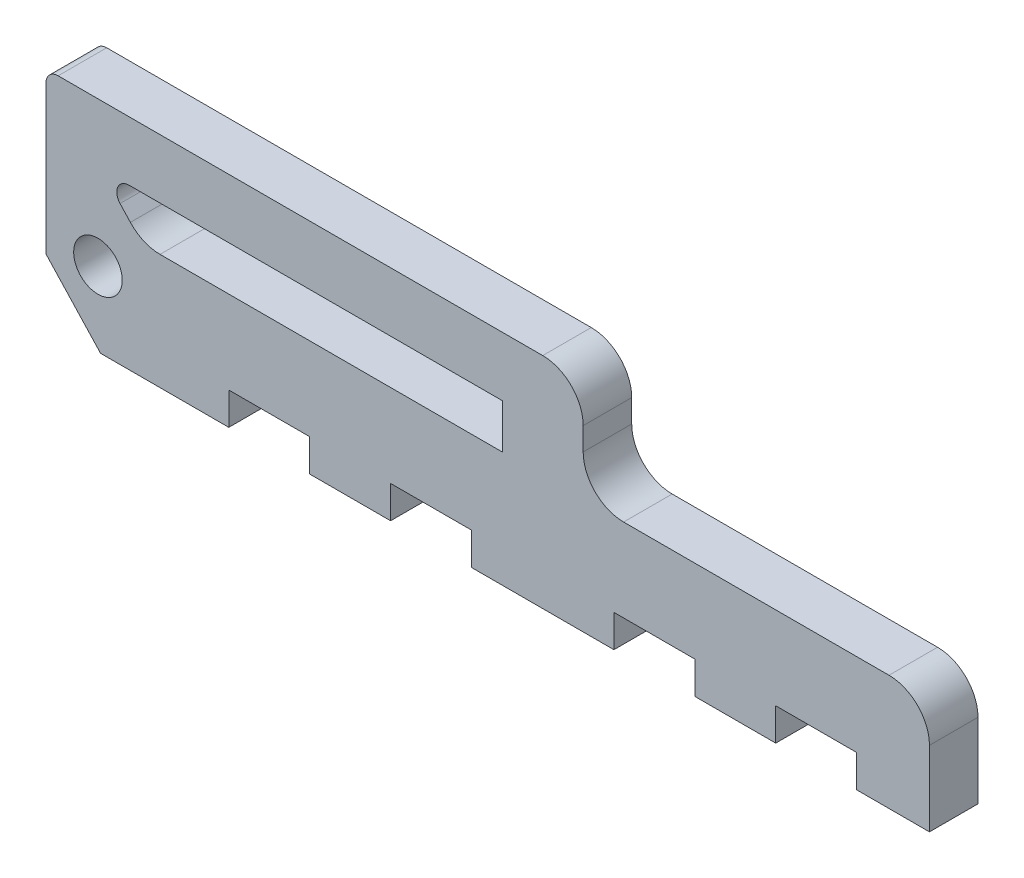
ISO-10303-21;
HEADER;
FILE_DESCRIPTION(('STEP AP214'),'2;1');
FILE_NAME('part.step','',(''),(''),'','','');
FILE_SCHEMA(('AUTOMOTIVE_DESIGN { 1 0 10303 214 1 1 1 1 }'));
ENDSEC;
DATA;
#1=APPLICATION_CONTEXT('core data for automotive mechanical design processes');
#2=APPLICATION_PROTOCOL_DEFINITION('international standard','automotive_design',2000,#1);
#3=PRODUCT_CONTEXT('',#1,'mechanical');
#4=PRODUCT('Part','Part','',(#3));
#5=PRODUCT_RELATED_PRODUCT_CATEGORY('part','',(#4));
#6=PRODUCT_DEFINITION_FORMATION('','',#4);
#7=PRODUCT_DEFINITION_CONTEXT('part definition',#1,'design');
#8=PRODUCT_DEFINITION('design','',#6,#7);
#9=PRODUCT_DEFINITION_SHAPE('','',#8);
#10=(LENGTH_UNIT() NAMED_UNIT(*) SI_UNIT(.MILLI.,.METRE.));
#11=(NAMED_UNIT(*) PLANE_ANGLE_UNIT() SI_UNIT($,.RADIAN.));
#12=(NAMED_UNIT(*) SI_UNIT($,.STERADIAN.) SOLID_ANGLE_UNIT());
#13=UNCERTAINTY_MEASURE_WITH_UNIT(LENGTH_MEASURE(1.E-05),#10,'distance_accuracy_value','');
#14=(GEOMETRIC_REPRESENTATION_CONTEXT(3) GLOBAL_UNCERTAINTY_ASSIGNED_CONTEXT((#13)) GLOBAL_UNIT_ASSIGNED_CONTEXT((#10,
#11,#12)) REPRESENTATION_CONTEXT('',''));
#15=CARTESIAN_POINT('',(0.,0.,0.));
#16=DIRECTION('',(0.,0.,1.));
#17=DIRECTION('',(1.,0.,0.));
#18=AXIS2_PLACEMENT_3D('',#15,#16,#17);
#19=CARTESIAN_POINT('',(10.9533371764944,-4.60706131559386,3.));
#20=DIRECTION('',(0.,0.,-1.));
#21=DIRECTION('',(-1.,0.,0.));
#22=AXIS2_PLACEMENT_3D('',#19,#20,#21);
#23=CYLINDRICAL_SURFACE('',#22,0.750000000000001);
#24=CARTESIAN_POINT('',(10.9533371764944,-4.60706131559386,0.));
#25=DIRECTION('',(0.,0.,-1.));
#26=DIRECTION('',(-1.,0.,0.));
#27=AXIS2_PLACEMENT_3D('',#24,#25,#26);
#28=CIRCLE('',#27,0.750000000000001);
#29=CARTESIAN_POINT('',(10.9533371764944,-3.85706131559386,0.));
#30=VERTEX_POINT('',#29);
#31=CARTESIAN_POINT('',(10.2033371764944,-4.60706131559386,0.));
#32=VERTEX_POINT('',#31);
#33=EDGE_CURVE('E19',#30,#32,#28,.F.);
#34=ORIENTED_EDGE('',*,*,#33,.T.);
#35=DIRECTION('',(0.,0.,-1.));
#36=VECTOR('',#35,1.);
#37=CARTESIAN_POINT('',(10.2033371764944,-4.60706131559386,3.));
#38=LINE('',#37,#36);
#39=CARTESIAN_POINT('',(10.2033371764944,-4.60706131559386,3.));
#40=VERTEX_POINT('',#39);
#41=EDGE_CURVE('E137',#32,#40,#38,.F.);
#42=ORIENTED_EDGE('',*,*,#41,.T.);
#43=CARTESIAN_POINT('',(10.9533371764944,-4.60706131559386,3.));
#44=DIRECTION('',(0.,0.,-1.));
#45=DIRECTION('',(-1.,0.,0.));
#46=AXIS2_PLACEMENT_3D('',#43,#44,#45);
#47=CIRCLE('',#46,0.750000000000001);
#48=CARTESIAN_POINT('',(10.9533371764944,-3.85706131559386,3.));
#49=VERTEX_POINT('',#48);
#50=EDGE_CURVE('E343',#40,#49,#47,.T.);
#51=ORIENTED_EDGE('',*,*,#50,.T.);
#52=DIRECTION('',(0.,0.,-1.));
#53=VECTOR('',#52,1.);
#54=CARTESIAN_POINT('',(10.9533371764944,-3.85706131559386,3.));
#55=LINE('',#54,#53);
#56=EDGE_CURVE('E140',#49,#30,#55,.T.);
#57=ORIENTED_EDGE('',*,*,#56,.T.);
#58=EDGE_LOOP('',(#34,#42,#51,#57));
#59=FACE_BOUND('',#58,.T.);
#60=ADVANCED_FACE('F16',(#59),#23,.T.);
#61=CARTESIAN_POINT('',(43.4,-3.85706131559386,3.));
#62=DIRECTION('',(-1.,0.,0.));
#63=DIRECTION('',(0.,0.,1.));
#64=AXIS2_PLACEMENT_3D('',#61,#62,#63);
#65=PLANE('',#64);
#66=DIRECTION('',(0.,0.,-1.));
#67=VECTOR('',#66,1.);
#68=CARTESIAN_POINT('',(43.4,-6.35706131559386,3.));
#69=LINE('',#68,#67);
#70=CARTESIAN_POINT('',(43.4,-6.35706131559386,3.));
#71=VERTEX_POINT('',#70);
#72=CARTESIAN_POINT('',(43.4,-6.35706131559386,0.));
#73=VERTEX_POINT('',#72);
#74=EDGE_CURVE('E318',#71,#73,#69,.T.);
#75=ORIENTED_EDGE('',*,*,#74,.F.);
#76=DIRECTION('',(0.,1.,0.));
#77=VECTOR('',#76,1.);
#78=CARTESIAN_POINT('',(43.4,0.,3.));
#79=LINE('',#78,#77);
#80=CARTESIAN_POINT('',(43.4,-7.76682140474012,3.));
#81=VERTEX_POINT('',#80);
#82=EDGE_CURVE('E344',#71,#81,#79,.F.);
#83=ORIENTED_EDGE('',*,*,#82,.T.);
#84=DIRECTION('',(0.,0.,1.));
#85=VECTOR('',#84,1.);
#86=CARTESIAN_POINT('',(43.4,-7.76682140474012,3.));
#87=LINE('',#86,#85);
#88=CARTESIAN_POINT('',(43.4,-7.76682140474012,0.));
#89=VERTEX_POINT('',#88);
#90=EDGE_CURVE('E313',#81,#89,#87,.F.);
#91=ORIENTED_EDGE('',*,*,#90,.T.);
#92=DIRECTION('',(0.,1.,0.));
#93=VECTOR('',#92,1.);
#94=CARTESIAN_POINT('',(43.4,-3.85706131559386,0.));
#95=LINE('',#94,#93);
#96=EDGE_CURVE('E142',#73,#89,#95,.F.);
#97=ORIENTED_EDGE('',*,*,#96,.F.);
#98=EDGE_LOOP('',(#75,#83,#91,#97));
#99=FACE_BOUND('',#98,.T.);
#100=ADVANCED_FACE('F412',(#99),#65,.F.);
#101=CARTESIAN_POINT('',(16.1596343147833,-10.2668214047401,3.));
#102=DIRECTION('',(0.732544010188143,0.680719672947296,0.));
#103=DIRECTION('',(-0.680719672947296,0.732544010188143,0.));
#104=AXIS2_PLACEMENT_3D('',#101,#102,#103);
#105=PLANE('',#104);
#106=DIRECTION('',(0.680719672947296,-0.732544010188143,0.));
#107=VECTOR('',#106,1.);
#108=CARTESIAN_POINT('',(14.7782975312678,-8.78032112124505,3.));
#109=LINE('',#108,#107);
#110=CARTESIAN_POINT('',(14.7782975312678,-8.78032112124505,3.));
#111=VERTEX_POINT('',#110);
#112=CARTESIAN_POINT('',(15.4179027710566,-9.46862058710836,3.));
#113=VERTEX_POINT('',#112);
#114=EDGE_CURVE('E341',#111,#113,#109,.T.);
#115=ORIENTED_EDGE('',*,*,#114,.T.);
#116=DIRECTION('',(0.,0.,1.));
#117=VECTOR('',#116,1.);
#118=CARTESIAN_POINT('',(15.4179027710566,-9.46862058710836,3.));
#119=LINE('',#118,#117);
#120=CARTESIAN_POINT('',(15.4179027710566,-9.46862058710836,0.));
#121=VERTEX_POINT('',#120);
#122=EDGE_CURVE('E181',#113,#121,#119,.F.);
#123=ORIENTED_EDGE('',*,*,#122,.T.);
#124=DIRECTION('',(-0.680719672947296,0.732544010188143,0.));
#125=VECTOR('',#124,1.);
#126=CARTESIAN_POINT('',(16.1596343147833,-10.2668214047401,0.));
#127=LINE('',#126,#125);
#128=CARTESIAN_POINT('',(14.7782975312678,-8.78032112124505,0.));
#129=VERTEX_POINT('',#128);
#130=EDGE_CURVE('E346',#121,#129,#127,.T.);
#131=ORIENTED_EDGE('',*,*,#130,.T.);
#132=DIRECTION('',(0.,0.,1.));
#133=VECTOR('',#132,1.);
#134=CARTESIAN_POINT('',(14.7782975312678,-8.78032112124505,3.));
#135=LINE('',#134,#133);
#136=EDGE_CURVE('E187',#129,#111,#135,.T.);
#137=ORIENTED_EDGE('',*,*,#136,.T.);
#138=EDGE_LOOP('',(#115,#123,#131,#137));
#139=FACE_BOUND('',#138,.T.);
#140=ADVANCED_FACE('F504',(#139),#105,.T.);
#141=CARTESIAN_POINT('',(0.,0.,3.));
#142=DIRECTION('',(0.,0.,-1.));
#143=DIRECTION('',(-1.,0.,0.));
#144=AXIS2_PLACEMENT_3D('',#141,#142,#143);
#145=PLANE('',#144);
#146=CARTESIAN_POINT('',(15.3277055389089,-8.26978136653458,3.));
#147=DIRECTION('',(0.,0.,1.));
#148=DIRECTION('',(1.,0.,0.));
#149=AXIS2_PLACEMENT_3D('',#146,#147,#148);
#150=CIRCLE('',#149,0.750000000000001);
#151=CARTESIAN_POINT('',(15.3277055389089,-7.51978136653458,3.));
#152=VERTEX_POINT('',#151);
#153=EDGE_CURVE('E184',#111,#152,#150,.F.);
#154=ORIENTED_EDGE('',*,*,#153,.T.);
#155=DIRECTION('',(1.,0.,0.));
#156=VECTOR('',#155,1.);
#157=CARTESIAN_POINT('',(13.6069355412309,-7.51978136653458,3.));
#158=LINE('',#157,#156);
#159=CARTESIAN_POINT('',(38.4000000000001,-7.51978136653458,3.));
#160=VERTEX_POINT('',#159);
#161=EDGE_CURVE('E188',#160,#152,#158,.F.);
#162=ORIENTED_EDGE('',*,*,#161,.F.);
#163=DIRECTION('',(0.,1.,0.));
#164=VECTOR('',#163,1.);
#165=CARTESIAN_POINT('',(38.4000000000001,-7.51978136653458,3.));
#166=LINE('',#165,#164);
#167=CARTESIAN_POINT('',(38.4000000000001,-10.2668214047401,3.));
#168=VERTEX_POINT('',#167);
#169=EDGE_CURVE('E178',#168,#160,#166,.T.);
#170=ORIENTED_EDGE('',*,*,#169,.F.);
#171=DIRECTION('',(1.,0.,0.));
#172=VECTOR('',#171,1.);
#173=CARTESIAN_POINT('',(38.4000000000001,-10.2668214047401,3.));
#174=LINE('',#173,#172);
#175=CARTESIAN_POINT('',(17.249262796527,-10.2668214047401,3.));
#176=VERTEX_POINT('',#175);
#177=EDGE_CURVE('E172',#176,#168,#174,.T.);
#178=ORIENTED_EDGE('',*,*,#177,.F.);
#179=CARTESIAN_POINT('',(17.249262796527,-7.76682140474012,3.));
#180=DIRECTION('',(0.,0.,1.));
#181=DIRECTION('',(1.,0.,0.));
#182=AXIS2_PLACEMENT_3D('',#179,#180,#181);
#183=CIRCLE('',#182,2.5);
#184=EDGE_CURVE('E173',#176,#113,#183,.F.);
#185=ORIENTED_EDGE('',*,*,#184,.T.);
#186=ORIENTED_EDGE('',*,*,#114,.F.);
#187=EDGE_LOOP('',(#154,#162,#170,#178,#185,#186));
#188=FACE_BOUND('',#187,.T.);
#189=ORIENTED_EDGE('',*,*,#50,.F.);
#190=DIRECTION('',(0.,1.,0.));
#191=VECTOR('',#190,1.);
#192=CARTESIAN_POINT('',(10.2033371764944,-13.7730374042159,3.));
#193=LINE('',#192,#191);
#194=CARTESIAN_POINT('',(10.2033371764944,-13.7730374042159,3.));
#195=VERTEX_POINT('',#194);
#196=EDGE_CURVE('E149',#40,#195,#193,.F.);
#197=ORIENTED_EDGE('',*,*,#196,.T.);
#198=DIRECTION('',(-0.680719672947296,0.732544010188143,0.));
#199=VECTOR('',#198,1.);
#200=CARTESIAN_POINT('',(11.2149622460133,-14.8616791971344,3.));
#201=LINE('',#200,#199);
#202=CARTESIAN_POINT('',(13.5737077721943,-17.4,3.));
#203=VERTEX_POINT('',#202);
#204=EDGE_CURVE('E197',#195,#203,#201,.F.);
#205=ORIENTED_EDGE('',*,*,#204,.T.);
#206=DIRECTION('',(1.,0.,0.));
#207=VECTOR('',#206,1.);
#208=CARTESIAN_POINT('',(17.,-17.4,3.));
#209=LINE('',#208,#207);
#210=CARTESIAN_POINT('',(21.5,-17.4,3.));
#211=VERTEX_POINT('',#210);
#212=EDGE_CURVE('E202',#203,#211,#209,.T.);
#213=ORIENTED_EDGE('',*,*,#212,.T.);
#214=DIRECTION('',(0.,-1.,0.));
#215=VECTOR('',#214,1.);
#216=CARTESIAN_POINT('',(21.5000000000001,-17.4,3.));
#217=LINE('',#216,#215);
#218=CARTESIAN_POINT('',(21.5,-15.4,3.));
#219=VERTEX_POINT('',#218);
#220=EDGE_CURVE('E208',#211,#219,#217,.F.);
#221=ORIENTED_EDGE('',*,*,#220,.T.);
#222=DIRECTION('',(1.,0.,0.));
#223=VECTOR('',#222,1.);
#224=CARTESIAN_POINT('',(21.5,-15.4,3.));
#225=LINE('',#224,#223);
#226=CARTESIAN_POINT('',(26.5,-15.4,3.));
#227=VERTEX_POINT('',#226);
#228=EDGE_CURVE('E214',#219,#227,#225,.T.);
#229=ORIENTED_EDGE('',*,*,#228,.T.);
#230=DIRECTION('',(0.,1.,0.));
#231=VECTOR('',#230,1.);
#232=CARTESIAN_POINT('',(26.5,-15.4,3.));
#233=LINE('',#232,#231);
#234=CARTESIAN_POINT('',(26.5000000000001,-17.4,3.));
#235=VERTEX_POINT('',#234);
#236=EDGE_CURVE('E220',#227,#235,#233,.F.);
#237=ORIENTED_EDGE('',*,*,#236,.T.);
#238=DIRECTION('',(1.,0.,0.));
#239=VECTOR('',#238,1.);
#240=CARTESIAN_POINT('',(26.5000000000001,-17.4,3.));
#241=LINE('',#240,#239);
#242=CARTESIAN_POINT('',(31.5000000000001,-17.4,3.));
#243=VERTEX_POINT('',#242);
#244=EDGE_CURVE('E226',#235,#243,#241,.T.);
#245=ORIENTED_EDGE('',*,*,#244,.T.);
#246=DIRECTION('',(0.,-1.,0.));
#247=VECTOR('',#246,1.);
#248=CARTESIAN_POINT('',(31.5000000000001,-17.4,3.));
#249=LINE('',#248,#247);
#250=CARTESIAN_POINT('',(31.5,-15.4,3.));
#251=VERTEX_POINT('',#250);
#252=EDGE_CURVE('E232',#243,#251,#249,.F.);
#253=ORIENTED_EDGE('',*,*,#252,.T.);
#254=DIRECTION('',(1.,0.,0.));
#255=VECTOR('',#254,1.);
#256=CARTESIAN_POINT('',(31.5,-15.4,3.));
#257=LINE('',#256,#255);
#258=CARTESIAN_POINT('',(36.5,-15.4,3.));
#259=VERTEX_POINT('',#258);
#260=EDGE_CURVE('E238',#251,#259,#257,.T.);
#261=ORIENTED_EDGE('',*,*,#260,.T.);
#262=DIRECTION('',(0.,1.,0.));
#263=VECTOR('',#262,1.);
#264=CARTESIAN_POINT('',(36.5,-15.4,3.));
#265=LINE('',#264,#263);
#266=CARTESIAN_POINT('',(36.5000000000001,-17.4,3.));
#267=VERTEX_POINT('',#266);
#268=EDGE_CURVE('E244',#259,#267,#265,.F.);
#269=ORIENTED_EDGE('',*,*,#268,.T.);
#270=DIRECTION('',(1.,0.,0.));
#271=VECTOR('',#270,1.);
#272=CARTESIAN_POINT('',(45.3,-17.4,3.));
#273=LINE('',#272,#271);
#274=CARTESIAN_POINT('',(45.3,-17.4,3.));
#275=VERTEX_POINT('',#274);
#276=EDGE_CURVE('E250',#267,#275,#273,.T.);
#277=ORIENTED_EDGE('',*,*,#276,.T.);
#278=DIRECTION('',(0.,1.,0.));
#279=VECTOR('',#278,1.);
#280=CARTESIAN_POINT('',(45.3,-15.4,3.));
#281=LINE('',#280,#279);
#282=CARTESIAN_POINT('',(45.3,-15.4,3.));
#283=VERTEX_POINT('',#282);
#284=EDGE_CURVE('E256',#275,#283,#281,.T.);
#285=ORIENTED_EDGE('',*,*,#284,.T.);
#286=DIRECTION('',(-1.,0.,0.));
#287=VECTOR('',#286,1.);
#288=CARTESIAN_POINT('',(50.3,-15.4,3.));
#289=LINE('',#288,#287);
#290=CARTESIAN_POINT('',(50.3,-15.4,3.));
#291=VERTEX_POINT('',#290);
#292=EDGE_CURVE('E262',#283,#291,#289,.F.);
#293=ORIENTED_EDGE('',*,*,#292,.T.);
#294=DIRECTION('',(0.,1.,0.));
#295=VECTOR('',#294,1.);
#296=CARTESIAN_POINT('',(50.3,-17.4,3.));
#297=LINE('',#296,#295);
#298=CARTESIAN_POINT('',(50.3,-17.4,3.));
#299=VERTEX_POINT('',#298);
#300=EDGE_CURVE('E268',#291,#299,#297,.F.);
#301=ORIENTED_EDGE('',*,*,#300,.T.);
#302=DIRECTION('',(1.,0.,0.));
#303=VECTOR('',#302,1.);
#304=CARTESIAN_POINT('',(55.3000000000001,-17.4,3.));
#305=LINE('',#304,#303);
#306=CARTESIAN_POINT('',(55.3000000000001,-17.4,3.));
#307=VERTEX_POINT('',#306);
#308=EDGE_CURVE('E274',#299,#307,#305,.T.);
#309=ORIENTED_EDGE('',*,*,#308,.T.);
#310=DIRECTION('',(0.,1.,0.));
#311=VECTOR('',#310,1.);
#312=CARTESIAN_POINT('',(55.3000000000001,-15.4,3.));
#313=LINE('',#312,#311);
#314=CARTESIAN_POINT('',(55.3000000000001,-15.4,3.));
#315=VERTEX_POINT('',#314);
#316=EDGE_CURVE('E280',#307,#315,#313,.T.);
#317=ORIENTED_EDGE('',*,*,#316,.T.);
#318=DIRECTION('',(1.,0.,0.));
#319=VECTOR('',#318,1.);
#320=CARTESIAN_POINT('',(60.3,-15.4,3.));
#321=LINE('',#320,#319);
#322=CARTESIAN_POINT('',(60.3,-15.4,3.));
#323=VERTEX_POINT('',#322);
#324=EDGE_CURVE('E286',#315,#323,#321,.T.);
#325=ORIENTED_EDGE('',*,*,#324,.T.);
#326=DIRECTION('',(0.,1.,0.));
#327=VECTOR('',#326,1.);
#328=CARTESIAN_POINT('',(60.3,-17.4,3.));
#329=LINE('',#328,#327);
#330=CARTESIAN_POINT('',(60.3,-17.4,3.));
#331=VERTEX_POINT('',#330);
#332=EDGE_CURVE('E303',#323,#331,#329,.F.);
#333=ORIENTED_EDGE('',*,*,#332,.T.);
#334=DIRECTION('',(1.,0.,0.));
#335=VECTOR('',#334,1.);
#336=CARTESIAN_POINT('',(64.8000000000001,-17.4,3.));
#337=LINE('',#336,#335);
#338=CARTESIAN_POINT('',(64.8000000000001,-17.4,3.));
#339=VERTEX_POINT('',#338);
#340=EDGE_CURVE('E292',#331,#339,#337,.T.);
#341=ORIENTED_EDGE('',*,*,#340,.T.);
#342=DIRECTION('',(0.,1.,0.));
#343=VECTOR('',#342,1.);
#344=CARTESIAN_POINT('',(64.8000000000001,-17.4,3.));
#345=LINE('',#344,#343);
#346=CARTESIAN_POINT('',(64.8000000000001,-12.7668214047401,3.));
#347=VERTEX_POINT('',#346);
#348=EDGE_CURVE('E293',#339,#347,#345,.T.);
#349=ORIENTED_EDGE('',*,*,#348,.T.);
#350=CARTESIAN_POINT('',(62.3,-12.7668214047401,3.));
#351=DIRECTION('',(0.,0.,-1.));
#352=DIRECTION('',(-1.,0.,0.));
#353=AXIS2_PLACEMENT_3D('',#350,#351,#352);
#354=CIRCLE('',#353,2.5);
#355=CARTESIAN_POINT('',(62.3,-10.2668214047401,3.));
#356=VERTEX_POINT('',#355);
#357=EDGE_CURVE('E309',#356,#347,#354,.T.);
#358=ORIENTED_EDGE('',*,*,#357,.F.);
#359=DIRECTION('',(1.,0.,0.));
#360=VECTOR('',#359,1.);
#361=CARTESIAN_POINT('',(64.8000000000001,-10.2668214047401,3.));
#362=LINE('',#361,#360);
#363=CARTESIAN_POINT('',(45.9,-10.2668214047401,3.));
#364=VERTEX_POINT('',#363);
#365=EDGE_CURVE('E312',#356,#364,#362,.F.);
#366=ORIENTED_EDGE('',*,*,#365,.T.);
#367=CARTESIAN_POINT('',(45.9,-7.76682140474012,3.));
#368=DIRECTION('',(0.,0.,1.));
#369=DIRECTION('',(1.,0.,0.));
#370=AXIS2_PLACEMENT_3D('',#367,#368,#369);
#371=CIRCLE('',#370,2.5);
#372=EDGE_CURVE('E316',#364,#81,#371,.F.);
#373=ORIENTED_EDGE('',*,*,#372,.T.);
#374=ORIENTED_EDGE('',*,*,#82,.F.);
#375=CARTESIAN_POINT('',(40.9,-6.35706131559386,3.));
#376=DIRECTION('',(0.,0.,-1.));
#377=DIRECTION('',(-1.,0.,0.));
#378=AXIS2_PLACEMENT_3D('',#375,#376,#377);
#379=CIRCLE('',#378,2.5);
#380=CARTESIAN_POINT('',(40.9,-3.85706131559386,3.));
#381=VERTEX_POINT('',#380);
#382=EDGE_CURVE('E321',#381,#71,#379,.T.);
#383=ORIENTED_EDGE('',*,*,#382,.F.);
#384=DIRECTION('',(1.,0.,0.));
#385=VECTOR('',#384,1.);
#386=CARTESIAN_POINT('',(10.2033371764944,-3.85706131559386,3.));
#387=LINE('',#386,#385);
#388=EDGE_CURVE('E324',#381,#49,#387,.F.);
#389=ORIENTED_EDGE('',*,*,#388,.T.);
#390=EDGE_LOOP('',(#189,#197,#205,#213,#221,#229,#237,#245,#253,#261,#269,#277,#285,#293,#301,
#309,#317,#325,#333,#341,#349,#358,#366,#373,#374,#383,#389));
#391=FACE_BOUND('',#390,.T.);
#392=CARTESIAN_POINT('',(13.4125942765777,-12.8195201782925,3.));
#393=DIRECTION('',(0.,0.,-1.));
#394=DIRECTION('',(-1.,0.,0.));
#395=AXIS2_PLACEMENT_3D('',#392,#393,#394);
#396=CIRCLE('',#395,1.5);
#397=CARTESIAN_POINT('',(11.9125942765777,-12.8195201782925,3.));
#398=VERTEX_POINT('',#397);
#399=EDGE_CURVE('E150',#398,#398,#396,.T.);
#400=ORIENTED_EDGE('',*,*,#399,.T.);
#401=EDGE_LOOP('',(#400));
#402=FACE_BOUND('',#401,.T.);
#403=ADVANCED_FACE('F403',(#188,#391,#402),#145,.F.);
#404=CARTESIAN_POINT('',(13.4125942765777,-12.8195201782925,3.));
#405=DIRECTION('',(0.,0.,-1.));
#406=DIRECTION('',(-1.,0.,0.));
#407=AXIS2_PLACEMENT_3D('',#404,#405,#406);
#408=CYLINDRICAL_SURFACE('',#407,1.5);
#409=ORIENTED_EDGE('',*,*,#399,.F.);
#410=EDGE_LOOP('',(#409));
#411=FACE_BOUND('',#410,.T.);
#412=CARTESIAN_POINT('',(13.4125942765777,-12.8195201782925,0.));
#413=DIRECTION('',(0.,0.,-1.));
#414=DIRECTION('',(-1.,0.,0.));
#415=AXIS2_PLACEMENT_3D('',#412,#413,#414);
#416=CIRCLE('',#415,1.5);
#417=CARTESIAN_POINT('',(11.9125942765777,-12.8195201782925,0.));
#418=VERTEX_POINT('',#417);
#419=EDGE_CURVE('E159',#418,#418,#416,.F.);
#420=ORIENTED_EDGE('',*,*,#419,.F.);
#421=EDGE_LOOP('',(#420));
#422=FACE_BOUND('',#421,.T.);
#423=ADVANCED_FACE('F512',(#411,#422),#408,.F.);
#424=CARTESIAN_POINT('',(10.2033371764944,-13.7730374042159,3.));
#425=DIRECTION('',(1.,0.,0.));
#426=DIRECTION('',(0.,0.,-1.));
#427=AXIS2_PLACEMENT_3D('',#424,#425,#426);
#428=PLANE('',#427);
#429=ORIENTED_EDGE('',*,*,#41,.F.);
#430=DIRECTION('',(0.,1.,0.));
#431=VECTOR('',#430,1.);
#432=CARTESIAN_POINT('',(10.2033371764944,0.,0.));
#433=LINE('',#432,#431);
#434=CARTESIAN_POINT('',(10.2033371764944,-13.7730374042159,0.));
#435=VERTEX_POINT('',#434);
#436=EDGE_CURVE('E147',#435,#32,#433,.T.);
#437=ORIENTED_EDGE('',*,*,#436,.F.);
#438=DIRECTION('',(0.,0.,1.));
#439=VECTOR('',#438,1.);
#440=CARTESIAN_POINT('',(10.2033371764944,-13.7730374042159,3.));
#441=LINE('',#440,#439);
#442=EDGE_CURVE('E201',#435,#195,#441,.T.);
#443=ORIENTED_EDGE('',*,*,#442,.T.);
#444=ORIENTED_EDGE('',*,*,#196,.F.);
#445=EDGE_LOOP('',(#429,#437,#443,#444));
#446=FACE_BOUND('',#445,.T.);
#447=ADVANCED_FACE('F145',(#446),#428,.F.);
#448=CARTESIAN_POINT('',(10.2033371764944,-3.85706131559386,3.));
#449=DIRECTION('',(0.,-1.,0.));
#450=DIRECTION('',(0.,0.,-1.));
#451=AXIS2_PLACEMENT_3D('',#448,#449,#450);
#452=PLANE('',#451);
#453=ORIENTED_EDGE('',*,*,#56,.F.);
#454=ORIENTED_EDGE('',*,*,#388,.F.);
#455=DIRECTION('',(0.,0.,-1.));
#456=VECTOR('',#455,1.);
#457=CARTESIAN_POINT('',(40.9,-3.85706131559386,3.));
#458=LINE('',#457,#456);
#459=CARTESIAN_POINT('',(40.9,-3.85706131559386,0.));
#460=VERTEX_POINT('',#459);
#461=EDGE_CURVE('E317',#460,#381,#458,.F.);
#462=ORIENTED_EDGE('',*,*,#461,.F.);
#463=DIRECTION('',(-1.,0.,0.));
#464=VECTOR('',#463,1.);
#465=CARTESIAN_POINT('',(0.,-3.85706131559386,0.));
#466=LINE('',#465,#464);
#467=EDGE_CURVE('E158',#30,#460,#466,.F.);
#468=ORIENTED_EDGE('',*,*,#467,.F.);
#469=EDGE_LOOP('',(#453,#454,#462,#468));
#470=FACE_BOUND('',#469,.T.);
#471=ADVANCED_FACE('F406',(#470),#452,.F.);
#472=CARTESIAN_POINT('',(40.9,-6.35706131559386,3.));
#473=DIRECTION('',(0.,0.,-1.));
#474=DIRECTION('',(-1.,0.,0.));
#475=AXIS2_PLACEMENT_3D('',#472,#473,#474);
#476=CYLINDRICAL_SURFACE('',#475,2.5);
#477=CARTESIAN_POINT('',(40.9,-6.35706131559386,0.));
#478=DIRECTION('',(0.,0.,-1.));
#479=DIRECTION('',(-1.,0.,0.));
#480=AXIS2_PLACEMENT_3D('',#477,#478,#479);
#481=CIRCLE('',#480,2.5);
#482=EDGE_CURVE('E161',#460,#73,#481,.T.);
#483=ORIENTED_EDGE('',*,*,#482,.F.);
#484=ORIENTED_EDGE('',*,*,#461,.T.);
#485=ORIENTED_EDGE('',*,*,#382,.T.);
#486=ORIENTED_EDGE('',*,*,#74,.T.);
#487=EDGE_LOOP('',(#483,#484,#485,#486));
#488=FACE_BOUND('',#487,.T.);
#489=ADVANCED_FACE('F409',(#488),#476,.T.);
#490=CARTESIAN_POINT('',(45.9,-7.76682140474012,3.));
#491=DIRECTION('',(0.,0.,1.));
#492=DIRECTION('',(1.,0.,0.));
#493=AXIS2_PLACEMENT_3D('',#490,#491,#492);
#494=CYLINDRICAL_SURFACE('',#493,2.5);
#495=DIRECTION('',(0.,0.,-1.));
#496=VECTOR('',#495,1.);
#497=CARTESIAN_POINT('',(45.9,-10.2668214047401,3.));
#498=LINE('',#497,#496);
#499=CARTESIAN_POINT('',(45.9,-10.2668214047401,0.));
#500=VERTEX_POINT('',#499);
#501=EDGE_CURVE('E310',#364,#500,#498,.T.);
#502=ORIENTED_EDGE('',*,*,#501,.T.);
#503=CARTESIAN_POINT('',(45.9,-7.76682140474012,0.));
#504=DIRECTION('',(0.,0.,1.));
#505=DIRECTION('',(1.,0.,0.));
#506=AXIS2_PLACEMENT_3D('',#503,#504,#505);
#507=CIRCLE('',#506,2.5);
#508=EDGE_CURVE('E385',#89,#500,#507,.T.);
#509=ORIENTED_EDGE('',*,*,#508,.F.);
#510=ORIENTED_EDGE('',*,*,#90,.F.);
#511=ORIENTED_EDGE('',*,*,#372,.F.);
#512=EDGE_LOOP('',(#502,#509,#510,#511));
#513=FACE_BOUND('',#512,.T.);
#514=ADVANCED_FACE('F417',(#513),#494,.F.);
#515=CARTESIAN_POINT('',(64.8000000000001,-10.2668214047401,3.));
#516=DIRECTION('',(0.,-1.,0.));
#517=DIRECTION('',(0.,0.,-1.));
#518=AXIS2_PLACEMENT_3D('',#515,#516,#517);
#519=PLANE('',#518);
#520=ORIENTED_EDGE('',*,*,#501,.F.);
#521=ORIENTED_EDGE('',*,*,#365,.F.);
#522=DIRECTION('',(0.,0.,-1.));
#523=VECTOR('',#522,1.);
#524=CARTESIAN_POINT('',(62.3,-10.2668214047401,3.));
#525=LINE('',#524,#523);
#526=CARTESIAN_POINT('',(62.3,-10.2668214047401,0.));
#527=VERTEX_POINT('',#526);
#528=EDGE_CURVE('E306',#527,#356,#525,.F.);
#529=ORIENTED_EDGE('',*,*,#528,.F.);
#530=DIRECTION('',(-1.,0.,0.));
#531=VECTOR('',#530,1.);
#532=CARTESIAN_POINT('',(0.,-10.2668214047401,0.));
#533=LINE('',#532,#531);
#534=EDGE_CURVE('E384',#500,#527,#533,.F.);
#535=ORIENTED_EDGE('',*,*,#534,.F.);
#536=EDGE_LOOP('',(#520,#521,#529,#535));
#537=FACE_BOUND('',#536,.T.);
#538=ADVANCED_FACE('F608',(#537),#519,.F.);
#539=CARTESIAN_POINT('',(62.3,-12.7668214047401,3.));
#540=DIRECTION('',(0.,0.,-1.));
#541=DIRECTION('',(-1.,0.,0.));
#542=AXIS2_PLACEMENT_3D('',#539,#540,#541);
#543=CYLINDRICAL_SURFACE('',#542,2.5);
#544=CARTESIAN_POINT('',(62.3,-12.7668214047401,0.));
#545=DIRECTION('',(0.,0.,-1.));
#546=DIRECTION('',(-1.,0.,0.));
#547=AXIS2_PLACEMENT_3D('',#544,#545,#546);
#548=CIRCLE('',#547,2.5);
#549=CARTESIAN_POINT('',(64.8000000000001,-12.7668214047401,0.));
#550=VERTEX_POINT('',#549);
#551=EDGE_CURVE('E381',#527,#550,#548,.T.);
#552=ORIENTED_EDGE('',*,*,#551,.F.);
#553=ORIENTED_EDGE('',*,*,#528,.T.);
#554=ORIENTED_EDGE('',*,*,#357,.T.);
#555=DIRECTION('',(0.,0.,1.));
#556=VECTOR('',#555,1.);
#557=CARTESIAN_POINT('',(64.8000000000001,-12.7668214047401,3.));
#558=LINE('',#557,#556);
#559=EDGE_CURVE('E290',#347,#550,#558,.F.);
#560=ORIENTED_EDGE('',*,*,#559,.T.);
#561=EDGE_LOOP('',(#552,#553,#554,#560));
#562=FACE_BOUND('',#561,.T.);
#563=ADVANCED_FACE('F604',(#562),#543,.T.);
#564=CARTESIAN_POINT('',(64.8000000000001,-17.4,3.));
#565=DIRECTION('',(-1.,0.,0.));
#566=DIRECTION('',(0.,0.,1.));
#567=AXIS2_PLACEMENT_3D('',#564,#565,#566);
#568=PLANE('',#567);
#569=ORIENTED_EDGE('',*,*,#559,.F.);
#570=ORIENTED_EDGE('',*,*,#348,.F.);
#571=DIRECTION('',(0.,0.,1.));
#572=VECTOR('',#571,1.);
#573=CARTESIAN_POINT('',(64.8000000000001,-17.4,3.));
#574=LINE('',#573,#572);
#575=CARTESIAN_POINT('',(64.8000000000001,-17.4,0.));
#576=VERTEX_POINT('',#575);
#577=EDGE_CURVE('E301',#339,#576,#574,.F.);
#578=ORIENTED_EDGE('',*,*,#577,.T.);
#579=DIRECTION('',(0.,1.,0.));
#580=VECTOR('',#579,1.);
#581=CARTESIAN_POINT('',(64.8000000000001,0.,0.));
#582=LINE('',#581,#580);
#583=EDGE_CURVE('E298',#550,#576,#582,.F.);
#584=ORIENTED_EDGE('',*,*,#583,.F.);
#585=EDGE_LOOP('',(#569,#570,#578,#584));
#586=FACE_BOUND('',#585,.T.);
#587=ADVANCED_FACE('F600',(#586),#568,.F.);
#588=CARTESIAN_POINT('',(64.8000000000001,-17.4,3.));
#589=DIRECTION('',(0.,1.,0.));
#590=DIRECTION('',(0.,0.,1.));
#591=AXIS2_PLACEMENT_3D('',#588,#589,#590);
#592=PLANE('',#591);
#593=ORIENTED_EDGE('',*,*,#577,.F.);
#594=ORIENTED_EDGE('',*,*,#340,.F.);
#595=DIRECTION('',(0.,0.,-1.));
#596=VECTOR('',#595,1.);
#597=CARTESIAN_POINT('',(60.3,-17.4,3.));
#598=LINE('',#597,#596);
#599=CARTESIAN_POINT('',(60.3,-17.4,0.));
#600=VERTEX_POINT('',#599);
#601=EDGE_CURVE('E289',#331,#600,#598,.T.);
#602=ORIENTED_EDGE('',*,*,#601,.T.);
#603=DIRECTION('',(-1.,0.,0.));
#604=VECTOR('',#603,1.);
#605=CARTESIAN_POINT('',(0.,-17.4,0.));
#606=LINE('',#605,#604);
#607=EDGE_CURVE('E294',#576,#600,#606,.T.);
#608=ORIENTED_EDGE('',*,*,#607,.F.);
#609=EDGE_LOOP('',(#593,#594,#602,#608));
#610=FACE_BOUND('',#609,.T.);
#611=ADVANCED_FACE('F596',(#610),#592,.F.);
#612=CARTESIAN_POINT('',(60.3,-17.4,3.));
#613=DIRECTION('',(1.,0.,0.));
#614=DIRECTION('',(0.,0.,-1.));
#615=AXIS2_PLACEMENT_3D('',#612,#613,#614);
#616=PLANE('',#615);
#617=ORIENTED_EDGE('',*,*,#601,.F.);
#618=ORIENTED_EDGE('',*,*,#332,.F.);
#619=DIRECTION('',(0.,0.,1.));
#620=VECTOR('',#619,1.);
#621=CARTESIAN_POINT('',(60.3,-15.4,3.));
#622=LINE('',#621,#620);
#623=CARTESIAN_POINT('',(60.3,-15.4,0.));
#624=VERTEX_POINT('',#623);
#625=EDGE_CURVE('E283',#323,#624,#622,.F.);
#626=ORIENTED_EDGE('',*,*,#625,.T.);
#627=DIRECTION('',(0.,1.,0.));
#628=VECTOR('',#627,1.);
#629=CARTESIAN_POINT('',(60.3,0.,0.));
#630=LINE('',#629,#628);
#631=EDGE_CURVE('E297',#600,#624,#630,.T.);
#632=ORIENTED_EDGE('',*,*,#631,.F.);
#633=EDGE_LOOP('',(#617,#618,#626,#632));
#634=FACE_BOUND('',#633,.T.);
#635=ADVANCED_FACE('F592',(#634),#616,.F.);
#636=CARTESIAN_POINT('',(60.3,-15.4,3.));
#637=DIRECTION('',(0.,1.,0.));
#638=DIRECTION('',(0.,0.,1.));
#639=AXIS2_PLACEMENT_3D('',#636,#637,#638);
#640=PLANE('',#639);
#641=ORIENTED_EDGE('',*,*,#625,.F.);
#642=ORIENTED_EDGE('',*,*,#324,.F.);
#643=DIRECTION('',(0.,0.,1.));
#644=VECTOR('',#643,1.);
#645=CARTESIAN_POINT('',(55.3000000000001,-15.4,3.));
#646=LINE('',#645,#644);
#647=CARTESIAN_POINT('',(55.3000000000001,-15.4,0.));
#648=VERTEX_POINT('',#647);
#649=EDGE_CURVE('E277',#315,#648,#646,.F.);
#650=ORIENTED_EDGE('',*,*,#649,.T.);
#651=DIRECTION('',(-1.,0.,0.));
#652=VECTOR('',#651,1.);
#653=CARTESIAN_POINT('',(0.,-15.4,0.));
#654=LINE('',#653,#652);
#655=EDGE_CURVE('E430',#624,#648,#654,.T.);
#656=ORIENTED_EDGE('',*,*,#655,.F.);
#657=EDGE_LOOP('',(#641,#642,#650,#656));
#658=FACE_BOUND('',#657,.T.);
#659=ADVANCED_FACE('F588',(#658),#640,.F.);
#660=CARTESIAN_POINT('',(55.3000000000001,-15.4,3.));
#661=DIRECTION('',(-1.,0.,0.));
#662=DIRECTION('',(0.,0.,1.));
#663=AXIS2_PLACEMENT_3D('',#660,#661,#662);
#664=PLANE('',#663);
#665=ORIENTED_EDGE('',*,*,#649,.F.);
#666=ORIENTED_EDGE('',*,*,#316,.F.);
#667=DIRECTION('',(0.,0.,1.));
#668=VECTOR('',#667,1.);
#669=CARTESIAN_POINT('',(55.3000000000001,-17.4,3.));
#670=LINE('',#669,#668);
#671=CARTESIAN_POINT('',(55.3000000000001,-17.4,0.));
#672=VERTEX_POINT('',#671);
#673=EDGE_CURVE('E271',#307,#672,#670,.F.);
#674=ORIENTED_EDGE('',*,*,#673,.T.);
#675=DIRECTION('',(0.,1.,0.));
#676=VECTOR('',#675,1.);
#677=CARTESIAN_POINT('',(55.3000000000001,0.,0.));
#678=LINE('',#677,#676);
#679=EDGE_CURVE('E433',#648,#672,#678,.F.);
#680=ORIENTED_EDGE('',*,*,#679,.F.);
#681=EDGE_LOOP('',(#665,#666,#674,#680));
#682=FACE_BOUND('',#681,.T.);
#683=ADVANCED_FACE('F584',(#682),#664,.F.);
#684=CARTESIAN_POINT('',(55.3000000000001,-17.4,3.));
#685=DIRECTION('',(0.,1.,0.));
#686=DIRECTION('',(0.,0.,1.));
#687=AXIS2_PLACEMENT_3D('',#684,#685,#686);
#688=PLANE('',#687);
#689=ORIENTED_EDGE('',*,*,#673,.F.);
#690=ORIENTED_EDGE('',*,*,#308,.F.);
#691=DIRECTION('',(0.,0.,-1.));
#692=VECTOR('',#691,1.);
#693=CARTESIAN_POINT('',(50.3,-17.4,3.));
#694=LINE('',#693,#692);
#695=CARTESIAN_POINT('',(50.3,-17.4,0.));
#696=VERTEX_POINT('',#695);
#697=EDGE_CURVE('E265',#299,#696,#694,.T.);
#698=ORIENTED_EDGE('',*,*,#697,.T.);
#699=DIRECTION('',(-1.,0.,0.));
#700=VECTOR('',#699,1.);
#701=CARTESIAN_POINT('',(0.,-17.4,0.));
#702=LINE('',#701,#700);
#703=EDGE_CURVE('E436',#672,#696,#702,.T.);
#704=ORIENTED_EDGE('',*,*,#703,.F.);
#705=EDGE_LOOP('',(#689,#690,#698,#704));
#706=FACE_BOUND('',#705,.T.);
#707=ADVANCED_FACE('F580',(#706),#688,.F.);
#708=CARTESIAN_POINT('',(50.3,-17.4,3.));
#709=DIRECTION('',(1.,0.,0.));
#710=DIRECTION('',(0.,0.,-1.));
#711=AXIS2_PLACEMENT_3D('',#708,#709,#710);
#712=PLANE('',#711);
#713=ORIENTED_EDGE('',*,*,#697,.F.);
#714=ORIENTED_EDGE('',*,*,#300,.F.);
#715=DIRECTION('',(0.,0.,1.));
#716=VECTOR('',#715,1.);
#717=CARTESIAN_POINT('',(50.3,-15.4,3.));
#718=LINE('',#717,#716);
#719=CARTESIAN_POINT('',(50.3,-15.4,0.));
#720=VERTEX_POINT('',#719);
#721=EDGE_CURVE('E259',#291,#720,#718,.F.);
#722=ORIENTED_EDGE('',*,*,#721,.T.);
#723=DIRECTION('',(0.,1.,0.));
#724=VECTOR('',#723,1.);
#725=CARTESIAN_POINT('',(50.3,0.,0.));
#726=LINE('',#725,#724);
#727=EDGE_CURVE('E439',#696,#720,#726,.T.);
#728=ORIENTED_EDGE('',*,*,#727,.F.);
#729=EDGE_LOOP('',(#713,#714,#722,#728));
#730=FACE_BOUND('',#729,.T.);
#731=ADVANCED_FACE('F576',(#730),#712,.F.);
#732=CARTESIAN_POINT('',(50.3,-15.4,3.));
#733=DIRECTION('',(0.,1.,0.));
#734=DIRECTION('',(-1.,0.,0.));
#735=AXIS2_PLACEMENT_3D('',#732,#733,#734);
#736=PLANE('',#735);
#737=ORIENTED_EDGE('',*,*,#721,.F.);
#738=ORIENTED_EDGE('',*,*,#292,.F.);
#739=DIRECTION('',(0.,0.,1.));
#740=VECTOR('',#739,1.);
#741=CARTESIAN_POINT('',(45.3,-15.4,3.));
#742=LINE('',#741,#740);
#743=CARTESIAN_POINT('',(45.3,-15.4,0.));
#744=VERTEX_POINT('',#743);
#745=EDGE_CURVE('E253',#283,#744,#742,.F.);
#746=ORIENTED_EDGE('',*,*,#745,.T.);
#747=DIRECTION('',(-1.,0.,0.));
#748=VECTOR('',#747,1.);
#749=CARTESIAN_POINT('',(0.,-15.4,0.));
#750=LINE('',#749,#748);
#751=EDGE_CURVE('E442',#720,#744,#750,.T.);
#752=ORIENTED_EDGE('',*,*,#751,.F.);
#753=EDGE_LOOP('',(#737,#738,#746,#752));
#754=FACE_BOUND('',#753,.T.);
#755=ADVANCED_FACE('F572',(#754),#736,.F.);
#756=CARTESIAN_POINT('',(45.3,-15.4,3.));
#757=DIRECTION('',(-1.,0.,0.));
#758=DIRECTION('',(0.,0.,1.));
#759=AXIS2_PLACEMENT_3D('',#756,#757,#758);
#760=PLANE('',#759);
#761=ORIENTED_EDGE('',*,*,#745,.F.);
#762=ORIENTED_EDGE('',*,*,#284,.F.);
#763=DIRECTION('',(0.,0.,1.));
#764=VECTOR('',#763,1.);
#765=CARTESIAN_POINT('',(45.3,-17.4,3.));
#766=LINE('',#765,#764);
#767=CARTESIAN_POINT('',(45.3,-17.4,0.));
#768=VERTEX_POINT('',#767);
#769=EDGE_CURVE('E247',#275,#768,#766,.F.);
#770=ORIENTED_EDGE('',*,*,#769,.T.);
#771=DIRECTION('',(0.,1.,0.));
#772=VECTOR('',#771,1.);
#773=CARTESIAN_POINT('',(45.3,0.,0.));
#774=LINE('',#773,#772);
#775=EDGE_CURVE('E445',#744,#768,#774,.F.);
#776=ORIENTED_EDGE('',*,*,#775,.F.);
#777=EDGE_LOOP('',(#761,#762,#770,#776));
#778=FACE_BOUND('',#777,.T.);
#779=ADVANCED_FACE('F568',(#778),#760,.F.);
#780=CARTESIAN_POINT('',(45.3,-17.4,3.));
#781=DIRECTION('',(0.,1.,0.));
#782=DIRECTION('',(0.,0.,1.));
#783=AXIS2_PLACEMENT_3D('',#780,#781,#782);
#784=PLANE('',#783);
#785=ORIENTED_EDGE('',*,*,#769,.F.);
#786=ORIENTED_EDGE('',*,*,#276,.F.);
#787=DIRECTION('',(0.,0.,1.));
#788=VECTOR('',#787,1.);
#789=CARTESIAN_POINT('',(36.5000000000001,-17.4,3.));
#790=LINE('',#789,#788);
#791=CARTESIAN_POINT('',(36.5000000000001,-17.4,0.));
#792=VERTEX_POINT('',#791);
#793=EDGE_CURVE('E241',#267,#792,#790,.F.);
#794=ORIENTED_EDGE('',*,*,#793,.T.);
#795=DIRECTION('',(-1.,0.,0.));
#796=VECTOR('',#795,1.);
#797=CARTESIAN_POINT('',(0.,-17.4,0.));
#798=LINE('',#797,#796);
#799=EDGE_CURVE('E448',#768,#792,#798,.T.);
#800=ORIENTED_EDGE('',*,*,#799,.F.);
#801=EDGE_LOOP('',(#785,#786,#794,#800));
#802=FACE_BOUND('',#801,.T.);
#803=ADVANCED_FACE('F564',(#802),#784,.F.);
#804=CARTESIAN_POINT('',(36.5,-15.4,3.));
#805=DIRECTION('',(1.,0.,0.));
#806=DIRECTION('',(0.,1.,0.));
#807=AXIS2_PLACEMENT_3D('',#804,#805,#806);
#808=PLANE('',#807);
#809=ORIENTED_EDGE('',*,*,#793,.F.);
#810=ORIENTED_EDGE('',*,*,#268,.F.);
#811=DIRECTION('',(0.,0.,1.));
#812=VECTOR('',#811,1.);
#813=CARTESIAN_POINT('',(36.5,-15.4,3.));
#814=LINE('',#813,#812);
#815=CARTESIAN_POINT('',(36.5,-15.4,0.));
#816=VERTEX_POINT('',#815);
#817=EDGE_CURVE('E235',#259,#816,#814,.F.);
#818=ORIENTED_EDGE('',*,*,#817,.T.);
#819=DIRECTION('',(0.,1.,0.));
#820=VECTOR('',#819,1.);
#821=CARTESIAN_POINT('',(36.5,0.,0.));
#822=LINE('',#821,#820);
#823=EDGE_CURVE('E451',#792,#816,#822,.T.);
#824=ORIENTED_EDGE('',*,*,#823,.F.);
#825=EDGE_LOOP('',(#809,#810,#818,#824));
#826=FACE_BOUND('',#825,.T.);
#827=ADVANCED_FACE('F560',(#826),#808,.F.);
#828=CARTESIAN_POINT('',(31.5,-15.4,3.));
#829=DIRECTION('',(0.,1.,0.));
#830=DIRECTION('',(0.,0.,1.));
#831=AXIS2_PLACEMENT_3D('',#828,#829,#830);
#832=PLANE('',#831);
#833=ORIENTED_EDGE('',*,*,#817,.F.);
#834=ORIENTED_EDGE('',*,*,#260,.F.);
#835=DIRECTION('',(0.,0.,1.));
#836=VECTOR('',#835,1.);
#837=CARTESIAN_POINT('',(31.5,-15.4,3.));
#838=LINE('',#837,#836);
#839=CARTESIAN_POINT('',(31.5,-15.4,0.));
#840=VERTEX_POINT('',#839);
#841=EDGE_CURVE('E229',#251,#840,#838,.F.);
#842=ORIENTED_EDGE('',*,*,#841,.T.);
#843=DIRECTION('',(-1.,0.,0.));
#844=VECTOR('',#843,1.);
#845=CARTESIAN_POINT('',(0.,-15.4,0.));
#846=LINE('',#845,#844);
#847=EDGE_CURVE('E454',#816,#840,#846,.T.);
#848=ORIENTED_EDGE('',*,*,#847,.F.);
#849=EDGE_LOOP('',(#833,#834,#842,#848));
#850=FACE_BOUND('',#849,.T.);
#851=ADVANCED_FACE('F556',(#850),#832,.F.);
#852=CARTESIAN_POINT('',(31.5000000000001,-17.4,3.));
#853=DIRECTION('',(-1.,0.,0.));
#854=DIRECTION('',(0.,-1.,0.));
#855=AXIS2_PLACEMENT_3D('',#852,#853,#854);
#856=PLANE('',#855);
#857=ORIENTED_EDGE('',*,*,#841,.F.);
#858=ORIENTED_EDGE('',*,*,#252,.F.);
#859=DIRECTION('',(0.,0.,1.));
#860=VECTOR('',#859,1.);
#861=CARTESIAN_POINT('',(31.5000000000001,-17.4,3.));
#862=LINE('',#861,#860);
#863=CARTESIAN_POINT('',(31.5000000000001,-17.4,0.));
#864=VERTEX_POINT('',#863);
#865=EDGE_CURVE('E223',#243,#864,#862,.F.);
#866=ORIENTED_EDGE('',*,*,#865,.T.);
#867=DIRECTION('',(0.,1.,0.));
#868=VECTOR('',#867,1.);
#869=CARTESIAN_POINT('',(31.5,0.,0.));
#870=LINE('',#869,#868);
#871=EDGE_CURVE('E457',#840,#864,#870,.F.);
#872=ORIENTED_EDGE('',*,*,#871,.F.);
#873=EDGE_LOOP('',(#857,#858,#866,#872));
#874=FACE_BOUND('',#873,.T.);
#875=ADVANCED_FACE('F552',(#874),#856,.F.);
#876=CARTESIAN_POINT('',(26.5000000000001,-17.4,3.));
#877=DIRECTION('',(0.,1.,0.));
#878=DIRECTION('',(0.,0.,1.));
#879=AXIS2_PLACEMENT_3D('',#876,#877,#878);
#880=PLANE('',#879);
#881=ORIENTED_EDGE('',*,*,#865,.F.);
#882=ORIENTED_EDGE('',*,*,#244,.F.);
#883=DIRECTION('',(0.,0.,1.));
#884=VECTOR('',#883,1.);
#885=CARTESIAN_POINT('',(26.5000000000001,-17.4,3.));
#886=LINE('',#885,#884);
#887=CARTESIAN_POINT('',(26.5000000000001,-17.4,0.));
#888=VERTEX_POINT('',#887);
#889=EDGE_CURVE('E217',#235,#888,#886,.F.);
#890=ORIENTED_EDGE('',*,*,#889,.T.);
#891=DIRECTION('',(-1.,0.,0.));
#892=VECTOR('',#891,1.);
#893=CARTESIAN_POINT('',(0.,-17.4,0.));
#894=LINE('',#893,#892);
#895=EDGE_CURVE('E460',#864,#888,#894,.T.);
#896=ORIENTED_EDGE('',*,*,#895,.F.);
#897=EDGE_LOOP('',(#881,#882,#890,#896));
#898=FACE_BOUND('',#897,.T.);
#899=ADVANCED_FACE('F548',(#898),#880,.F.);
#900=CARTESIAN_POINT('',(26.5,-15.4,3.));
#901=DIRECTION('',(1.,0.,0.));
#902=DIRECTION('',(0.,1.,0.));
#903=AXIS2_PLACEMENT_3D('',#900,#901,#902);
#904=PLANE('',#903);
#905=ORIENTED_EDGE('',*,*,#889,.F.);
#906=ORIENTED_EDGE('',*,*,#236,.F.);
#907=DIRECTION('',(0.,0.,1.));
#908=VECTOR('',#907,1.);
#909=CARTESIAN_POINT('',(26.5,-15.4,3.));
#910=LINE('',#909,#908);
#911=CARTESIAN_POINT('',(26.5,-15.4,0.));
#912=VERTEX_POINT('',#911);
#913=EDGE_CURVE('E211',#227,#912,#910,.F.);
#914=ORIENTED_EDGE('',*,*,#913,.T.);
#915=DIRECTION('',(0.,1.,0.));
#916=VECTOR('',#915,1.);
#917=CARTESIAN_POINT('',(26.5000000000001,0.,0.));
#918=LINE('',#917,#916);
#919=EDGE_CURVE('E463',#888,#912,#918,.T.);
#920=ORIENTED_EDGE('',*,*,#919,.F.);
#921=EDGE_LOOP('',(#905,#906,#914,#920));
#922=FACE_BOUND('',#921,.T.);
#923=ADVANCED_FACE('F544',(#922),#904,.F.);
#924=CARTESIAN_POINT('',(21.5,-15.4,3.));
#925=DIRECTION('',(0.,1.,0.));
#926=DIRECTION('',(0.,0.,1.));
#927=AXIS2_PLACEMENT_3D('',#924,#925,#926);
#928=PLANE('',#927);
#929=ORIENTED_EDGE('',*,*,#913,.F.);
#930=ORIENTED_EDGE('',*,*,#228,.F.);
#931=DIRECTION('',(0.,0.,1.));
#932=VECTOR('',#931,1.);
#933=CARTESIAN_POINT('',(21.5,-15.4,3.));
#934=LINE('',#933,#932);
#935=CARTESIAN_POINT('',(21.5,-15.4,0.));
#936=VERTEX_POINT('',#935);
#937=EDGE_CURVE('E205',#219,#936,#934,.F.);
#938=ORIENTED_EDGE('',*,*,#937,.T.);
#939=DIRECTION('',(-1.,0.,0.));
#940=VECTOR('',#939,1.);
#941=CARTESIAN_POINT('',(0.,-15.4,0.));
#942=LINE('',#941,#940);
#943=EDGE_CURVE('E466',#912,#936,#942,.T.);
#944=ORIENTED_EDGE('',*,*,#943,.F.);
#945=EDGE_LOOP('',(#929,#930,#938,#944));
#946=FACE_BOUND('',#945,.T.);
#947=ADVANCED_FACE('F540',(#946),#928,.F.);
#948=CARTESIAN_POINT('',(21.5000000000001,-17.4,3.));
#949=DIRECTION('',(-1.,0.,0.));
#950=DIRECTION('',(0.,-1.,0.));
#951=AXIS2_PLACEMENT_3D('',#948,#949,#950);
#952=PLANE('',#951);
#953=ORIENTED_EDGE('',*,*,#937,.F.);
#954=ORIENTED_EDGE('',*,*,#220,.F.);
#955=DIRECTION('',(0.,0.,1.));
#956=VECTOR('',#955,1.);
#957=CARTESIAN_POINT('',(21.5000000000001,-17.4,3.));
#958=LINE('',#957,#956);
#959=CARTESIAN_POINT('',(21.5000000000001,-17.4,0.));
#960=VERTEX_POINT('',#959);
#961=EDGE_CURVE('E198',#211,#960,#958,.F.);
#962=ORIENTED_EDGE('',*,*,#961,.T.);
#963=DIRECTION('',(0.,1.,0.));
#964=VECTOR('',#963,1.);
#965=CARTESIAN_POINT('',(21.5,0.,0.));
#966=LINE('',#965,#964);
#967=EDGE_CURVE('E469',#936,#960,#966,.F.);
#968=ORIENTED_EDGE('',*,*,#967,.F.);
#969=EDGE_LOOP('',(#953,#954,#962,#968));
#970=FACE_BOUND('',#969,.T.);
#971=ADVANCED_FACE('F536',(#970),#952,.F.);
#972=CARTESIAN_POINT('',(17.,-17.4,3.));
#973=DIRECTION('',(0.,1.,0.));
#974=DIRECTION('',(0.,0.,1.));
#975=AXIS2_PLACEMENT_3D('',#972,#973,#974);
#976=PLANE('',#975);
#977=ORIENTED_EDGE('',*,*,#961,.F.);
#978=ORIENTED_EDGE('',*,*,#212,.F.);
#979=DIRECTION('',(0.,0.,1.));
#980=VECTOR('',#979,1.);
#981=CARTESIAN_POINT('',(13.5737077721943,-17.4,3.));
#982=LINE('',#981,#980);
#983=CARTESIAN_POINT('',(13.5737077721943,-17.4,0.));
#984=VERTEX_POINT('',#983);
#985=EDGE_CURVE('E194',#203,#984,#982,.F.);
#986=ORIENTED_EDGE('',*,*,#985,.T.);
#987=DIRECTION('',(-1.,0.,0.));
#988=VECTOR('',#987,1.);
#989=CARTESIAN_POINT('',(0.,-17.4,0.));
#990=LINE('',#989,#988);
#991=EDGE_CURVE('E331',#960,#984,#990,.T.);
#992=ORIENTED_EDGE('',*,*,#991,.F.);
#993=EDGE_LOOP('',(#977,#978,#986,#992));
#994=FACE_BOUND('',#993,.T.);
#995=ADVANCED_FACE('F532',(#994),#976,.F.);
#996=CARTESIAN_POINT('',(11.2149622460133,-14.8616791971344,3.));
#997=DIRECTION('',(0.732544010188143,0.680719672947296,0.));
#998=DIRECTION('',(-0.680719672947296,0.732544010188143,0.));
#999=AXIS2_PLACEMENT_3D('',#996,#997,#998);
#1000=PLANE('',#999);
#1001=ORIENTED_EDGE('',*,*,#985,.F.);
#1002=ORIENTED_EDGE('',*,*,#204,.F.);
#1003=ORIENTED_EDGE('',*,*,#442,.F.);
#1004=DIRECTION('',(-0.680719672947296,0.732544010188143,0.));
#1005=VECTOR('',#1004,1.);
#1006=CARTESIAN_POINT('',(13.5737077721943,-17.4,0.));
#1007=LINE('',#1006,#1005);
#1008=EDGE_CURVE('E157',#984,#435,#1007,.T.);
#1009=ORIENTED_EDGE('',*,*,#1008,.F.);
#1010=EDGE_LOOP('',(#1001,#1002,#1003,#1009));
#1011=FACE_BOUND('',#1010,.T.);
#1012=ADVANCED_FACE('F529',(#1011),#1000,.F.);
#1013=CARTESIAN_POINT('',(13.6069355412309,-7.51978136653458,3.));
#1014=DIRECTION('',(0.,-1.,0.));
#1015=DIRECTION('',(0.,0.,-1.));
#1016=AXIS2_PLACEMENT_3D('',#1013,#1014,#1015);
#1017=PLANE('',#1016);
#1018=DIRECTION('',(-1.,0.,0.));
#1019=VECTOR('',#1018,1.);
#1020=CARTESIAN_POINT('',(0.,-7.51978136653458,0.));
#1021=LINE('',#1020,#1019);
#1022=CARTESIAN_POINT('',(38.4000000000001,-7.51978136653458,0.));
#1023=VERTEX_POINT('',#1022);
#1024=CARTESIAN_POINT('',(15.3277055389089,-7.51978136653458,0.));
#1025=VERTEX_POINT('',#1024);
#1026=EDGE_CURVE('E330',#1023,#1025,#1021,.T.);
#1027=ORIENTED_EDGE('',*,*,#1026,.F.);
#1028=DIRECTION('',(0.,0.,1.));
#1029=VECTOR('',#1028,1.);
#1030=CARTESIAN_POINT('',(38.4000000000001,-7.51978136653458,3.));
#1031=LINE('',#1030,#1029);
#1032=EDGE_CURVE('E164',#160,#1023,#1031,.F.);
#1033=ORIENTED_EDGE('',*,*,#1032,.F.);
#1034=ORIENTED_EDGE('',*,*,#161,.T.);
#1035=DIRECTION('',(0.,0.,1.));
#1036=VECTOR('',#1035,1.);
#1037=CARTESIAN_POINT('',(15.3277055389089,-7.51978136653458,3.));
#1038=LINE('',#1037,#1036);
#1039=EDGE_CURVE('E185',#152,#1025,#1038,.F.);
#1040=ORIENTED_EDGE('',*,*,#1039,.T.);
#1041=EDGE_LOOP('',(#1027,#1033,#1034,#1040));
#1042=FACE_BOUND('',#1041,.T.);
#1043=ADVANCED_FACE('F496',(#1042),#1017,.T.);
#1044=CARTESIAN_POINT('',(15.3277055389089,-8.26978136653458,3.));
#1045=DIRECTION('',(0.,0.,1.));
#1046=DIRECTION('',(1.,0.,0.));
#1047=AXIS2_PLACEMENT_3D('',#1044,#1045,#1046);
#1048=CYLINDRICAL_SURFACE('',#1047,0.750000000000001);
#1049=ORIENTED_EDGE('',*,*,#136,.F.);
#1050=CARTESIAN_POINT('',(15.3277055389089,-8.26978136653458,0.));
#1051=DIRECTION('',(0.,0.,1.));
#1052=DIRECTION('',(1.,0.,0.));
#1053=AXIS2_PLACEMENT_3D('',#1050,#1051,#1052);
#1054=CIRCLE('',#1053,0.750000000000001);
#1055=EDGE_CURVE('E378',#1025,#129,#1054,.T.);
#1056=ORIENTED_EDGE('',*,*,#1055,.F.);
#1057=ORIENTED_EDGE('',*,*,#1039,.F.);
#1058=ORIENTED_EDGE('',*,*,#153,.F.);
#1059=EDGE_LOOP('',(#1049,#1056,#1057,#1058));
#1060=FACE_BOUND('',#1059,.T.);
#1061=ADVANCED_FACE('F501',(#1060),#1048,.F.);
#1062=CARTESIAN_POINT('',(17.249262796527,-7.76682140474012,3.));
#1063=DIRECTION('',(0.,0.,1.));
#1064=DIRECTION('',(1.,0.,0.));
#1065=AXIS2_PLACEMENT_3D('',#1062,#1063,#1064);
#1066=CYLINDRICAL_SURFACE('',#1065,2.5);
#1067=DIRECTION('',(0.,0.,1.));
#1068=VECTOR('',#1067,1.);
#1069=CARTESIAN_POINT('',(17.249262796527,-10.2668214047401,3.));
#1070=LINE('',#1069,#1068);
#1071=CARTESIAN_POINT('',(17.249262796527,-10.2668214047401,0.));
#1072=VERTEX_POINT('',#1071);
#1073=EDGE_CURVE('E170',#1072,#176,#1070,.T.);
#1074=ORIENTED_EDGE('',*,*,#1073,.F.);
#1075=CARTESIAN_POINT('',(17.249262796527,-7.76682140474012,0.));
#1076=DIRECTION('',(0.,0.,1.));
#1077=DIRECTION('',(1.,0.,0.));
#1078=AXIS2_PLACEMENT_3D('',#1075,#1076,#1077);
#1079=CIRCLE('',#1078,2.5);
#1080=EDGE_CURVE('E375',#121,#1072,#1079,.T.);
#1081=ORIENTED_EDGE('',*,*,#1080,.F.);
#1082=ORIENTED_EDGE('',*,*,#122,.F.);
#1083=ORIENTED_EDGE('',*,*,#184,.F.);
#1084=EDGE_LOOP('',(#1074,#1081,#1082,#1083));
#1085=FACE_BOUND('',#1084,.T.);
#1086=ADVANCED_FACE('F486',(#1085),#1066,.F.);
#1087=CARTESIAN_POINT('',(38.4000000000001,-10.2668214047401,3.));
#1088=DIRECTION('',(0.,1.,0.));
#1089=DIRECTION('',(0.,0.,1.));
#1090=AXIS2_PLACEMENT_3D('',#1087,#1088,#1089);
#1091=PLANE('',#1090);
#1092=ORIENTED_EDGE('',*,*,#177,.T.);
#1093=DIRECTION('',(0.,0.,1.));
#1094=VECTOR('',#1093,1.);
#1095=CARTESIAN_POINT('',(38.4000000000001,-10.2668214047401,3.));
#1096=LINE('',#1095,#1094);
#1097=CARTESIAN_POINT('',(38.4000000000001,-10.2668214047401,0.));
#1098=VERTEX_POINT('',#1097);
#1099=EDGE_CURVE('E34',#1098,#168,#1096,.T.);
#1100=ORIENTED_EDGE('',*,*,#1099,.F.);
#1101=DIRECTION('',(-1.,0.,0.));
#1102=VECTOR('',#1101,1.);
#1103=CARTESIAN_POINT('',(0.,-10.2668214047401,0.));
#1104=LINE('',#1103,#1102);
#1105=EDGE_CURVE('E25',#1072,#1098,#1104,.F.);
#1106=ORIENTED_EDGE('',*,*,#1105,.F.);
#1107=ORIENTED_EDGE('',*,*,#1073,.T.);
#1108=EDGE_LOOP('',(#1092,#1100,#1106,#1107));
#1109=FACE_BOUND('',#1108,.T.);
#1110=ADVANCED_FACE('F482',(#1109),#1091,.T.);
#1111=CARTESIAN_POINT('',(38.4000000000001,-7.51978136653458,3.));
#1112=DIRECTION('',(-1.,0.,0.));
#1113=DIRECTION('',(0.,0.,1.));
#1114=AXIS2_PLACEMENT_3D('',#1111,#1112,#1113);
#1115=PLANE('',#1114);
#1116=ORIENTED_EDGE('',*,*,#169,.T.);
#1117=ORIENTED_EDGE('',*,*,#1032,.T.);
#1118=DIRECTION('',(0.,1.,0.));
#1119=VECTOR('',#1118,1.);
#1120=CARTESIAN_POINT('',(38.4000000000001,0.,0.));
#1121=LINE('',#1120,#1119);
#1122=EDGE_CURVE('E11',#1098,#1023,#1121,.T.);
#1123=ORIENTED_EDGE('',*,*,#1122,.F.);
#1124=ORIENTED_EDGE('',*,*,#1099,.T.);
#1125=EDGE_LOOP('',(#1116,#1117,#1123,#1124));
#1126=FACE_BOUND('',#1125,.T.);
#1127=ADVANCED_FACE('F492',(#1126),#1115,.T.);
#1128=CARTESIAN_POINT('',(0.,0.,0.));
#1129=DIRECTION('',(0.,0.,-1.));
#1130=DIRECTION('',(-1.,0.,0.));
#1131=AXIS2_PLACEMENT_3D('',#1128,#1129,#1130);
#1132=PLANE('',#1131);
#1133=ORIENTED_EDGE('',*,*,#1105,.T.);
#1134=ORIENTED_EDGE('',*,*,#1122,.T.);
#1135=ORIENTED_EDGE('',*,*,#1026,.T.);
#1136=ORIENTED_EDGE('',*,*,#1055,.T.);
#1137=ORIENTED_EDGE('',*,*,#130,.F.);
#1138=ORIENTED_EDGE('',*,*,#1080,.T.);
#1139=EDGE_LOOP('',(#1133,#1134,#1135,#1136,#1137,#1138));
#1140=FACE_BOUND('',#1139,.T.);
#1141=ORIENTED_EDGE('',*,*,#991,.T.);
#1142=ORIENTED_EDGE('',*,*,#1008,.T.);
#1143=ORIENTED_EDGE('',*,*,#436,.T.);
#1144=ORIENTED_EDGE('',*,*,#33,.F.);
#1145=ORIENTED_EDGE('',*,*,#467,.T.);
#1146=ORIENTED_EDGE('',*,*,#482,.T.);
#1147=ORIENTED_EDGE('',*,*,#96,.T.);
#1148=ORIENTED_EDGE('',*,*,#508,.T.);
#1149=ORIENTED_EDGE('',*,*,#534,.T.);
#1150=ORIENTED_EDGE('',*,*,#551,.T.);
#1151=ORIENTED_EDGE('',*,*,#583,.T.);
#1152=ORIENTED_EDGE('',*,*,#607,.T.);
#1153=ORIENTED_EDGE('',*,*,#631,.T.);
#1154=ORIENTED_EDGE('',*,*,#655,.T.);
#1155=ORIENTED_EDGE('',*,*,#679,.T.);
#1156=ORIENTED_EDGE('',*,*,#703,.T.);
#1157=ORIENTED_EDGE('',*,*,#727,.T.);
#1158=ORIENTED_EDGE('',*,*,#751,.T.);
#1159=ORIENTED_EDGE('',*,*,#775,.T.);
#1160=ORIENTED_EDGE('',*,*,#799,.T.);
#1161=ORIENTED_EDGE('',*,*,#823,.T.);
#1162=ORIENTED_EDGE('',*,*,#847,.T.);
#1163=ORIENTED_EDGE('',*,*,#871,.T.);
#1164=ORIENTED_EDGE('',*,*,#895,.T.);
#1165=ORIENTED_EDGE('',*,*,#919,.T.);
#1166=ORIENTED_EDGE('',*,*,#943,.T.);
#1167=ORIENTED_EDGE('',*,*,#967,.T.);
#1168=EDGE_LOOP('',(#1141,#1142,#1143,#1144,#1145,#1146,#1147,#1148,#1149,#1150,#1151,#1152,
#1153,#1154,#1155,#1156,#1157,#1158,#1159,#1160,#1161,#1162,#1163,#1164,#1165,#1166,#1167));
#1169=FACE_BOUND('',#1168,.T.);
#1170=ORIENTED_EDGE('',*,*,#419,.T.);
#1171=EDGE_LOOP('',(#1170));
#1172=FACE_BOUND('',#1171,.T.);
#1173=ADVANCED_FACE('F154',(#1140,#1169,#1172),#1132,.T.);
#1174=CLOSED_SHELL('',(#60,#100,#140,#403,#423,#447,#471,#489,#514,#538,#563,#587,#611,#635,
#659,#683,#707,#731,#755,#779,#803,#827,#851,#875,#899,#923,#947,#971,#995,#1012,#1043,#1061,
#1086,#1110,#1127,#1173));
#1175=MANIFOLD_SOLID_BREP('B1',#1174);
#1176=ADVANCED_BREP_SHAPE_REPRESENTATION('',(#18,#1175),#14);
#1177=SHAPE_DEFINITION_REPRESENTATION(#9,#1176);
ENDSEC;
END-ISO-10303-21;
